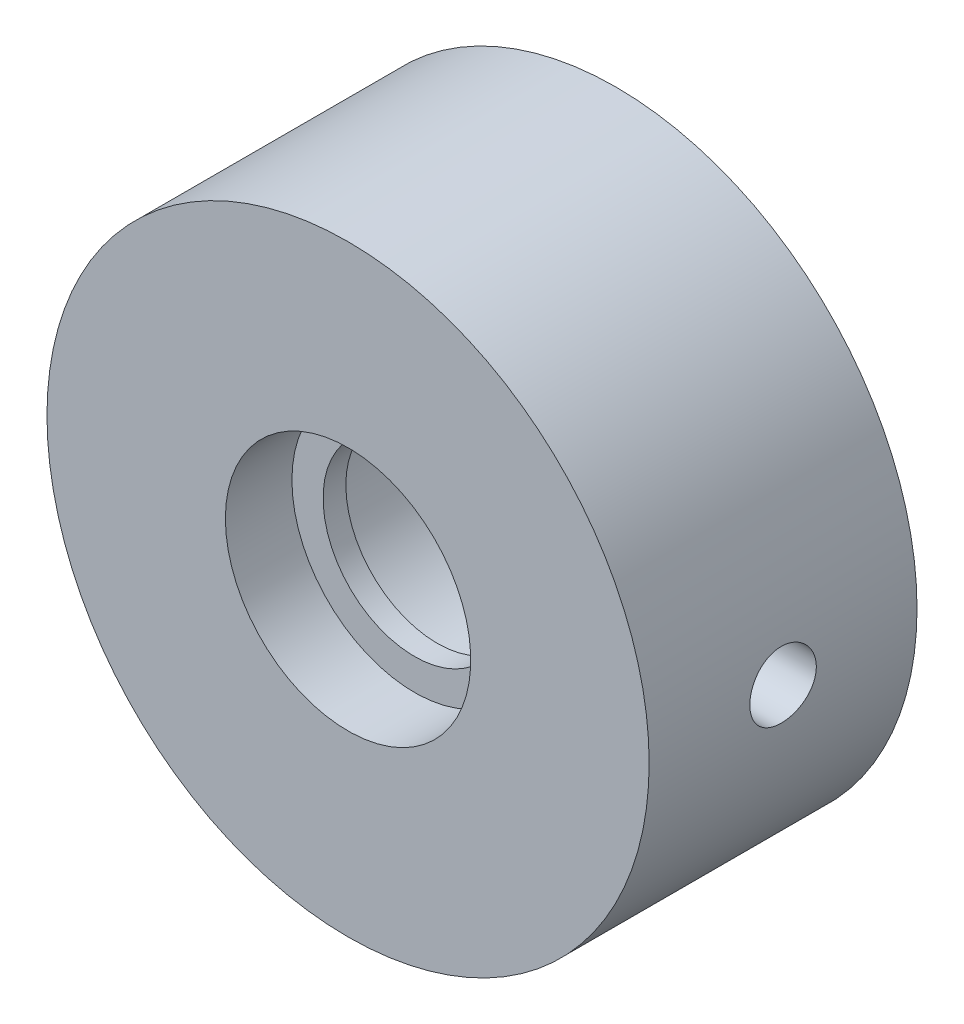
ISO-10303-21;
HEADER;
FILE_DESCRIPTION(('STEP AP214'),'2;1');
FILE_NAME('part.step','',(''),(''),'','','');
FILE_SCHEMA(('AUTOMOTIVE_DESIGN { 1 0 10303 214 1 1 1 1 }'));
ENDSEC;
DATA;
#1=APPLICATION_CONTEXT('core data for automotive mechanical design processes');
#2=APPLICATION_PROTOCOL_DEFINITION('international standard','automotive_design',2000,#1);
#3=PRODUCT_CONTEXT('',#1,'mechanical');
#4=PRODUCT('Part','Part','',(#3));
#5=PRODUCT_RELATED_PRODUCT_CATEGORY('part','',(#4));
#6=PRODUCT_DEFINITION_FORMATION('','',#4);
#7=PRODUCT_DEFINITION_CONTEXT('part definition',#1,'design');
#8=PRODUCT_DEFINITION('design','',#6,#7);
#9=PRODUCT_DEFINITION_SHAPE('','',#8);
#10=(LENGTH_UNIT() NAMED_UNIT(*) SI_UNIT(.MILLI.,.METRE.));
#11=(NAMED_UNIT(*) PLANE_ANGLE_UNIT() SI_UNIT($,.RADIAN.));
#12=(NAMED_UNIT(*) SI_UNIT($,.STERADIAN.) SOLID_ANGLE_UNIT());
#13=UNCERTAINTY_MEASURE_WITH_UNIT(LENGTH_MEASURE(1.E-05),#10,'distance_accuracy_value','');
#14=(GEOMETRIC_REPRESENTATION_CONTEXT(3) GLOBAL_UNCERTAINTY_ASSIGNED_CONTEXT((#13)) GLOBAL_UNIT_ASSIGNED_CONTEXT((#10,
#11,#12)) REPRESENTATION_CONTEXT('',''));
#15=CARTESIAN_POINT('',(0.,0.,0.));
#16=DIRECTION('',(0.,0.,1.));
#17=DIRECTION('',(1.,0.,0.));
#18=AXIS2_PLACEMENT_3D('',#15,#16,#17);
#19=CARTESIAN_POINT('',(0.,0.,12.7));
#20=DIRECTION('',(0.,0.,-1.));
#21=DIRECTION('',(-1.,0.,0.));
#22=AXIS2_PLACEMENT_3D('',#19,#20,#21);
#23=CYLINDRICAL_SURFACE('',#22,29.45);
#24=CARTESIAN_POINT('',(-29.45,0.,2.85));
#25=CARTESIAN_POINT('',(-29.4499977149586,-0.181960383413232,2.84999217446561));
#26=CARTESIAN_POINT('',(-29.4482957263121,-0.364038517707953,2.8346671753996));
#27=CARTESIAN_POINT('',(-29.4416698356493,-0.723139621909861,2.77376818784163));
#28=CARTESIAN_POINT('',(-29.4367424558724,-0.900156919729154,2.7281615475707));
#29=CARTESIAN_POINT('',(-29.4242215634285,-1.24388475956675,2.60804944180506));
#30=CARTESIAN_POINT('',(-29.4166297330742,-1.41060172719956,2.53356220818509));
#31=CARTESIAN_POINT('',(-29.3996270771881,-1.72913310495346,2.35784053475641));
#32=CARTESIAN_POINT('',(-29.3902165941078,-1.88095031259178,2.25661112917446));
#33=CARTESIAN_POINT('',(-29.3705837732319,-2.16606596648808,2.02980801548477));
#34=CARTESIAN_POINT('',(-29.3603584377793,-2.29929055881077,1.90414171562264));
#35=CARTESIAN_POINT('',(-29.340272914812,-2.54280390997775,1.63223017289141));
#36=CARTESIAN_POINT('',(-29.3304127448486,-2.6530915675656,1.48598394249615));
#37=CARTESIAN_POINT('',(-29.3121438744106,-2.84786774975347,1.17659411493971));
#38=CARTESIAN_POINT('',(-29.303739014861,-2.93228844317707,1.01340756842412));
#39=CARTESIAN_POINT('',(-29.2893706621716,-3.07250117978127,0.675066177501417));
#40=CARTESIAN_POINT('',(-29.283407096312,-3.12829407572217,0.49991168976958));
#41=CARTESIAN_POINT('',(-29.2746243646764,-3.20944616023457,0.143365575104309));
#42=CARTESIAN_POINT('',(-29.2717924446061,-3.23492882599818,-0.037997628138731));
#43=CARTESIAN_POINT('',(-29.2695543123403,-3.25511893582278,-0.402447022288139));
#44=CARTESIAN_POINT('',(-29.270147991671,-3.24982735436872,-0.585533158453516));
#45=CARTESIAN_POINT('',(-29.2746823184672,-3.20872078512459,-0.947376498382265));
#46=CARTESIAN_POINT('',(-29.2786081319526,-3.17304107664745,-1.12614928244152));
#47=CARTESIAN_POINT('',(-29.2893412373593,-3.07238178521974,-1.47515393371042));
#48=CARTESIAN_POINT('',(-29.2961485758003,-3.00740172924009,-1.64538566298274));
#49=CARTESIAN_POINT('',(-29.3118947025559,-2.84983848905485,-1.97290055105099));
#50=CARTESIAN_POINT('',(-29.3208380799992,-2.75719576485262,-2.13015483629939));
#51=CARTESIAN_POINT('',(-29.3398448589826,-2.54697968071543,-2.42693484093901));
#52=CARTESIAN_POINT('',(-29.3499083004653,-2.42940543156216,-2.56645992770922));
#53=CARTESIAN_POINT('',(-29.3700873721813,-2.17191049522814,-2.8246066892524));
#54=CARTESIAN_POINT('',(-29.3802029921148,-2.03187306443937,-2.94311194714852));
#55=CARTESIAN_POINT('',(-29.3992957570561,-1.73383096145639,-3.1549512073783));
#56=CARTESIAN_POINT('',(-29.4082729003268,-1.57582626184756,-3.24828517130465));
#57=CARTESIAN_POINT('',(-29.4240811421124,-1.24625059955246,-3.40712960387388));
#58=CARTESIAN_POINT('',(-29.4309117436384,-1.07467650663679,-3.47263363028452));
#59=CARTESIAN_POINT('',(-29.4416524644483,-0.722872816990234,-3.57387070648923));
#60=CARTESIAN_POINT('',(-29.4455626901665,-0.542643535955741,-3.60960484126366));
#61=CARTESIAN_POINT('',(-29.450008353616,-0.179653073637615,-3.65013884660106));
#62=CARTESIAN_POINT('',(-29.4505613050385,0.00308997507644454,-3.65509925557423));
#63=CARTESIAN_POINT('',(-29.4482772054799,0.366804755844156,-3.63436743191762));
#64=CARTESIAN_POINT('',(-29.4454402104758,0.5477765170967,-3.60867570543569));
#65=CARTESIAN_POINT('',(-29.4367060642113,0.902344231830607,-3.52750216585696));
#66=CARTESIAN_POINT('',(-29.4308166907755,1.07595772442449,-3.47209605613906));
#67=CARTESIAN_POINT('',(-29.4166379376567,1.41142720014704,-3.33314467485076));
#68=CARTESIAN_POINT('',(-29.4083484932122,1.57328286586479,-3.24959864396606));
#69=CARTESIAN_POINT('',(-29.3902519271435,1.88136462330686,-3.05634462394116));
#70=CARTESIAN_POINT('',(-29.3804387800833,2.02752458741648,-2.94653178900514));
#71=CARTESIAN_POINT('',(-29.3604138212173,2.29939529771544,-2.70401089277464));
#72=CARTESIAN_POINT('',(-29.3502019971814,2.42510541595537,-2.57130212867709));
#73=CARTESIAN_POINT('',(-29.3304773923802,2.65307013921571,-2.28605337193399));
#74=CARTESIAN_POINT('',(-29.3209678895867,2.75521896674557,-2.13342858514379));
#75=CARTESIAN_POINT('',(-29.3037761686943,2.93243293343001,-1.81309582481772));
#76=CARTESIAN_POINT('',(-29.2960939209767,3.00749851159833,-1.64538809582822));
#77=CARTESIAN_POINT('',(-29.283447806849,3.1282403081622,-1.30000447642978));
#78=CARTESIAN_POINT('',(-29.2784782409849,3.17397818087037,-1.12235035703359));
#79=CARTESIAN_POINT('',(-29.2718030390295,3.23496573333356,-0.76182578399482));
#80=CARTESIAN_POINT('',(-29.270097286978,3.25021649626864,-0.578955515911538));
#81=CARTESIAN_POINT('',(-29.2701456691,3.24978001675806,-0.214241333117374));
#82=CARTESIAN_POINT('',(-29.2718812211429,3.23425893418351,-0.0323971944360969));
#83=CARTESIAN_POINT('',(-29.2785769125366,3.17306908840828,0.326082528942359));
#84=CARTESIAN_POINT('',(-29.2835370543802,3.12740030190202,0.502718109612974));
#85=CARTESIAN_POINT('',(-29.2961176615934,3.00725970242105,0.84575731079249));
#86=CARTESIAN_POINT('',(-29.3037375620662,2.9327940051589,1.01216309515248));
#87=CARTESIAN_POINT('',(-29.3207801866999,2.75719006992938,1.33014198635245));
#88=CARTESIAN_POINT('',(-29.330202913552,2.65605179214502,1.48171507104961));
#89=CARTESIAN_POINT('',(-29.3498504947385,2.42935202374099,1.76657702871552));
#90=CARTESIAN_POINT('',(-29.360079255527,2.30366659303234,1.89976700209277));
#91=CARTESIAN_POINT('',(-29.3801510861024,2.03169260707532,2.14323419611267));
#92=CARTESIAN_POINT('',(-29.3899940635266,1.88539915600056,2.25350595664449));
#93=CARTESIAN_POINT('',(-29.4082169324075,1.57586994447326,2.4482770804155));
#94=CARTESIAN_POINT('',(-29.4165923396586,1.41258460660709,2.53269802355485));
#95=CARTESIAN_POINT('',(-29.43088925699,1.07416226480783,2.67280696091186));
#96=CARTESIAN_POINT('',(-29.4368134936662,0.899038683063386,2.72852689811667));
#97=CARTESIAN_POINT('',(-29.4440752845522,0.602463008697075,2.79597250400879));
#98=CARTESIAN_POINT('',(-29.4462865142643,0.482897465914857,2.81620458305384));
#99=CARTESIAN_POINT('',(-29.4492496287908,0.242238674853296,2.84322090048217));
#100=CARTESIAN_POINT('',(-29.450001521333,0.121145434667265,2.85000521007787));
#101=CARTESIAN_POINT('',(-29.45,0.,2.85));
#102=B_SPLINE_CURVE_WITH_KNOTS('',3,(#24,#25,#26,#27,#28,#29,#30,#31,#32,#33,#34,#35,#36,#37,
#38,#39,#40,#41,#42,#43,#44,#45,#46,#47,#48,#49,#50,#51,#52,#53,#54,#55,#56,#57,#58,#59,#60,#61,
#62,#63,#64,#65,#66,#67,#68,#69,#70,#71,#72,#73,#74,#75,#76,#77,#78,#79,#80,#81,#82,#83,#84,#85,
#86,#87,#88,#89,#90,#91,#92,#93,#94,#95,#96,#97,#98,#99,#100,#101),.UNSPECIFIED.,.T.,.F.,(4,2,2,
2,2,2,2,2,2,2,2,2,2,2,2,2,2,2,2,2,2,2,2,2,2,2,2,2,2,2,2,2,2,2,2,2,2,2,4),(0.,0.545438723906535,
1.09146653509159,1.63715020707216,2.18273122694985,2.73042122341586,3.27813750970529,
3.82727802212007,4.37640217587458,4.92328157249786,5.47014365195199,6.01458390561283,
6.55903294911109,7.10466239471214,7.65031130423784,8.19889380903299,8.7474771508714,
9.29618741280331,9.84487767580779,10.3907031427842,10.936519596863,11.4809520339322,
12.0253991628854,12.5720568622237,13.1187313445055,13.6678142989444,14.2168883524651,
14.7648042948169,15.3127007698537,15.8576468053305,16.4025932620761,16.9474240499126,
17.4922556510805,18.0399127811064,18.5877002375891,19.1371333454872,19.6859536294502,
20.049097298237,20.412239043998),.UNSPECIFIED.);
#103=CARTESIAN_POINT('',(-29.45,0.,2.85));
#104=VERTEX_POINT('',#103);
#105=EDGE_CURVE('E45',#104,#104,#102,.T.);
#106=ORIENTED_EDGE('',*,*,#105,.T.);
#107=EDGE_LOOP('',(#106));
#108=FACE_BOUND('',#107,.T.);
#109=CARTESIAN_POINT('',(0.,0.,12.7));
#110=DIRECTION('',(0.,0.,1.));
#111=DIRECTION('',(1.,0.,0.));
#112=AXIS2_PLACEMENT_3D('',#109,#110,#111);
#113=CIRCLE('',#112,29.45);
#114=CARTESIAN_POINT('',(29.45,0.,12.7));
#115=VERTEX_POINT('',#114);
#116=EDGE_CURVE('E53',#115,#115,#113,.T.);
#117=ORIENTED_EDGE('',*,*,#116,.F.);
#118=EDGE_LOOP('',(#117));
#119=FACE_BOUND('',#118,.T.);
#120=CARTESIAN_POINT('',(0.,0.,-13.5));
#121=DIRECTION('',(0.,0.,-1.));
#122=DIRECTION('',(-1.,0.,0.));
#123=AXIS2_PLACEMENT_3D('',#120,#121,#122);
#124=CIRCLE('',#123,29.45);
#125=CARTESIAN_POINT('',(-29.45,0.,-13.5));
#126=VERTEX_POINT('',#125);
#127=EDGE_CURVE('E106',#126,#126,#124,.T.);
#128=ORIENTED_EDGE('',*,*,#127,.F.);
#129=EDGE_LOOP('',(#128));
#130=FACE_BOUND('',#129,.T.);
#131=CARTESIAN_POINT('',(29.45,0.,-3.65));
#132=CARTESIAN_POINT('',(29.4499977149586,0.181960383413232,-3.6499921744656));
#133=CARTESIAN_POINT('',(29.4482957263121,0.364038517707953,-3.63466717539959));
#134=CARTESIAN_POINT('',(29.4416698356493,0.723139621909861,-3.57376818784162));
#135=CARTESIAN_POINT('',(29.4367424558724,0.900156919729154,-3.5281615475707));
#136=CARTESIAN_POINT('',(29.4242215634285,1.24388475956675,-3.40804944180505));
#137=CARTESIAN_POINT('',(29.4166297330742,1.41060172719956,-3.33356220818508));
#138=CARTESIAN_POINT('',(29.3996270771881,1.72913310495346,-3.1578405347564));
#139=CARTESIAN_POINT('',(29.3902165941078,1.88095031259178,-3.05661112917446));
#140=CARTESIAN_POINT('',(29.3705837732319,2.16606596648808,-2.82980801548477));
#141=CARTESIAN_POINT('',(29.3603584377793,2.29929055881077,-2.70414171562264));
#142=CARTESIAN_POINT('',(29.340272914812,2.54280390997775,-2.4322301728914));
#143=CARTESIAN_POINT('',(29.3304127448486,2.6530915675656,-2.28598394249615));
#144=CARTESIAN_POINT('',(29.3121438744106,2.84786774975347,-1.9765941149397));
#145=CARTESIAN_POINT('',(29.303739014861,2.93228844317707,-1.81340756842411));
#146=CARTESIAN_POINT('',(29.2893706621716,3.07250117978127,-1.47506617750141));
#147=CARTESIAN_POINT('',(29.283407096312,3.12829407572217,-1.29991168976958));
#148=CARTESIAN_POINT('',(29.2746243646764,3.20944616023457,-0.943365575104304));
#149=CARTESIAN_POINT('',(29.2717924446061,3.23492882599818,-0.762002371861264));
#150=CARTESIAN_POINT('',(29.2695543123403,3.25511893582278,-0.397552977711856));
#151=CARTESIAN_POINT('',(29.270147991671,3.24982735436872,-0.214466841546479));
#152=CARTESIAN_POINT('',(29.2746823184672,3.20872078512459,0.14737649838227));
#153=CARTESIAN_POINT('',(29.2786081319526,3.17304107664745,0.326149282441523));
#154=CARTESIAN_POINT('',(29.2893412373593,3.07238178521974,0.675153933710431));
#155=CARTESIAN_POINT('',(29.2961485758003,3.00740172924009,0.845385662982745));
#156=CARTESIAN_POINT('',(29.3118947025559,2.84983848905485,1.172900551051));
#157=CARTESIAN_POINT('',(29.3208380799992,2.75719576485262,1.3301548362994));
#158=CARTESIAN_POINT('',(29.3398448589826,2.54697968071543,1.62693484093902));
#159=CARTESIAN_POINT('',(29.3499083004653,2.42940543156216,1.76645992770922));
#160=CARTESIAN_POINT('',(29.3700873721813,2.17191049522814,2.02460668925241));
#161=CARTESIAN_POINT('',(29.3802029921148,2.03187306443937,2.14311194714853));
#162=CARTESIAN_POINT('',(29.3992957570561,1.73383096145639,2.35495120737831));
#163=CARTESIAN_POINT('',(29.4082729003268,1.57582626184756,2.44828517130465));
#164=CARTESIAN_POINT('',(29.4240811421124,1.24625059955246,2.60712960387388));
#165=CARTESIAN_POINT('',(29.4309117436384,1.07467650663679,2.67263363028452));
#166=CARTESIAN_POINT('',(29.4416524644483,0.722872816990234,2.77387070648923));
#167=CARTESIAN_POINT('',(29.4455626901665,0.54264353595574,2.80960484126366));
#168=CARTESIAN_POINT('',(29.450008353616,0.179653073637614,2.85013884660107));
#169=CARTESIAN_POINT('',(29.4505613050385,-0.00308997507644535,2.85509925557424));
#170=CARTESIAN_POINT('',(29.4482772054799,-0.366804755844157,2.83436743191763));
#171=CARTESIAN_POINT('',(29.4454402104758,-0.547776517096701,2.80867570543569));
#172=CARTESIAN_POINT('',(29.4367060642113,-0.902344231830608,2.72750216585696));
#173=CARTESIAN_POINT('',(29.4308166907755,-1.07595772442449,2.67209605613907));
#174=CARTESIAN_POINT('',(29.4166379376567,-1.41142720014704,2.53314467485077));
#175=CARTESIAN_POINT('',(29.4083484932122,-1.57328286586479,2.44959864396606));
#176=CARTESIAN_POINT('',(29.3902519271435,-1.88136462330686,2.25634462394116));
#177=CARTESIAN_POINT('',(29.3804387800833,-2.02752458741648,2.14653178900514));
#178=CARTESIAN_POINT('',(29.3604138212173,-2.29939529771544,1.90401089277464));
#179=CARTESIAN_POINT('',(29.3502019971814,-2.42510541595537,1.7713021286771));
#180=CARTESIAN_POINT('',(29.3304773923802,-2.65307013921571,1.48605337193399));
#181=CARTESIAN_POINT('',(29.3209678895867,-2.75521896674557,1.33342858514379));
#182=CARTESIAN_POINT('',(29.3037761686943,-2.93243293343001,1.01309582481773));
#183=CARTESIAN_POINT('',(29.2960939209767,-3.00749851159833,0.845388095828223));
#184=CARTESIAN_POINT('',(29.283447806849,-3.1282403081622,0.500004476429781));
#185=CARTESIAN_POINT('',(29.2784782409849,-3.17397818087037,0.322350357033594));
#186=CARTESIAN_POINT('',(29.2718030390295,-3.23496573333356,-0.0381742160051773));
#187=CARTESIAN_POINT('',(29.270097286978,-3.25021649626864,-0.221044484088459));
#188=CARTESIAN_POINT('',(29.2701456691,-3.24978001675806,-0.585758666882624));
#189=CARTESIAN_POINT('',(29.2718812211429,-3.23425893418351,-0.767602805563901));
#190=CARTESIAN_POINT('',(29.2785769125366,-3.17306908840828,-1.12608252894236));
#191=CARTESIAN_POINT('',(29.2835370543802,-3.12740030190202,-1.30271810961297));
#192=CARTESIAN_POINT('',(29.2961176615934,-3.00725970242105,-1.64575731079249));
#193=CARTESIAN_POINT('',(29.3037375620662,-2.9327940051589,-1.81216309515248));
#194=CARTESIAN_POINT('',(29.3207801866999,-2.75719006992938,-2.13014198635245));
#195=CARTESIAN_POINT('',(29.330202913552,-2.65605179214501,-2.28171507104961));
#196=CARTESIAN_POINT('',(29.3498504947385,-2.42935202374098,-2.56657702871551));
#197=CARTESIAN_POINT('',(29.360079255527,-2.30366659303234,-2.69976700209277));
#198=CARTESIAN_POINT('',(29.3801510861024,-2.03169260707532,-2.94323419611266));
#199=CARTESIAN_POINT('',(29.3899940635266,-1.88539915600056,-3.05350595664449));
#200=CARTESIAN_POINT('',(29.4082169324075,-1.57586994447326,-3.24827708041549));
#201=CARTESIAN_POINT('',(29.4165923396586,-1.41258460660708,-3.33269802355484));
#202=CARTESIAN_POINT('',(29.43088925699,-1.07416226480783,-3.47280696091185));
#203=CARTESIAN_POINT('',(29.4368134936662,-0.899038683063384,-3.52852689811667));
#204=CARTESIAN_POINT('',(29.4440752845522,-0.602463008697073,-3.59597250400879));
#205=CARTESIAN_POINT('',(29.4462865142643,-0.482897465914856,-3.61620458305384));
#206=CARTESIAN_POINT('',(29.4492496287908,-0.242238674853296,-3.64322090048216));
#207=CARTESIAN_POINT('',(29.450001521333,-0.121145434667265,-3.65000521007786));
#208=CARTESIAN_POINT('',(29.45,0.,-3.65));
#209=B_SPLINE_CURVE_WITH_KNOTS('',3,(#131,#132,#133,#134,#135,#136,#137,#138,#139,#140,#141,
#142,#143,#144,#145,#146,#147,#148,#149,#150,#151,#152,#153,#154,#155,#156,#157,#158,#159,#160,
#161,#162,#163,#164,#165,#166,#167,#168,#169,#170,#171,#172,#173,#174,#175,#176,#177,#178,#179,
#180,#181,#182,#183,#184,#185,#186,#187,#188,#189,#190,#191,#192,#193,#194,#195,#196,#197,#198,
#199,#200,#201,#202,#203,#204,#205,#206,#207,#208),.UNSPECIFIED.,.T.,.F.,(4,2,2,2,2,2,2,2,2,2,2,
2,2,2,2,2,2,2,2,2,2,2,2,2,2,2,2,2,2,2,2,2,2,2,2,2,2,2,4),(0.,0.545438723906535,1.09146653509159,
1.63715020707216,2.18273122694985,2.73042122341586,3.27813750970529,3.82727802212007,
4.37640217587458,4.92328157249786,5.47014365195199,6.01458390561283,6.55903294911109,
7.10466239471214,7.65031130423784,8.19889380903299,8.7474771508714,9.29618741280331,
9.84487767580779,10.3907031427842,10.936519596863,11.4809520339322,12.0253991628854,
12.5720568622237,13.1187313445055,13.6678142989444,14.2168883524651,14.7648042948169,
15.3127007698538,15.8576468053305,16.4025932620761,16.9474240499126,17.4922556510805,
18.0399127811064,18.5877002375891,19.1371333454872,19.6859536294502,20.049097298237,
20.412239043998),.UNSPECIFIED.);
#210=CARTESIAN_POINT('',(29.45,0.,-3.65));
#211=VERTEX_POINT('',#210);
#212=EDGE_CURVE('E10',#211,#211,#209,.T.);
#213=ORIENTED_EDGE('',*,*,#212,.F.);
#214=EDGE_LOOP('',(#213));
#215=FACE_BOUND('',#214,.T.);
#216=ADVANCED_FACE('F35',(#108,#119,#130,#215),#23,.T.);
#217=CARTESIAN_POINT('',(0.,0.,12.7));
#218=DIRECTION('',(0.,0.,-1.));
#219=DIRECTION('',(-1.,0.,0.));
#220=AXIS2_PLACEMENT_3D('',#217,#218,#219);
#221=CYLINDRICAL_SURFACE('',#220,12.);
#222=CARTESIAN_POINT('',(0.,0.,12.7));
#223=DIRECTION('',(0.,0.,-1.));
#224=DIRECTION('',(-1.,0.,0.));
#225=AXIS2_PLACEMENT_3D('',#222,#223,#224);
#226=CIRCLE('',#225,12.);
#227=CARTESIAN_POINT('',(-12.,0.,12.7));
#228=VERTEX_POINT('',#227);
#229=EDGE_CURVE('E120',#228,#228,#226,.T.);
#230=ORIENTED_EDGE('',*,*,#229,.F.);
#231=EDGE_LOOP('',(#230));
#232=FACE_BOUND('',#231,.T.);
#233=CARTESIAN_POINT('',(0.,0.,6.19125));
#234=DIRECTION('',(0.,0.,-1.));
#235=DIRECTION('',(-1.,0.,0.));
#236=AXIS2_PLACEMENT_3D('',#233,#234,#235);
#237=CIRCLE('',#236,12.);
#238=CARTESIAN_POINT('',(-12.,0.,6.19125));
#239=VERTEX_POINT('',#238);
#240=EDGE_CURVE('E49',#239,#239,#237,.F.);
#241=ORIENTED_EDGE('',*,*,#240,.F.);
#242=EDGE_LOOP('',(#241));
#243=FACE_BOUND('',#242,.T.);
#244=ADVANCED_FACE('F87',(#232,#243),#221,.F.);
#245=CARTESIAN_POINT('',(0.,0.,12.7));
#246=DIRECTION('',(0.,0.,1.));
#247=DIRECTION('',(1.,0.,0.));
#248=AXIS2_PLACEMENT_3D('',#245,#246,#247);
#249=PLANE('',#248);
#250=ORIENTED_EDGE('',*,*,#229,.T.);
#251=EDGE_LOOP('',(#250));
#252=FACE_BOUND('',#251,.T.);
#253=ORIENTED_EDGE('',*,*,#116,.T.);
#254=EDGE_LOOP('',(#253));
#255=FACE_BOUND('',#254,.T.);
#256=ADVANCED_FACE('F85',(#252,#255),#249,.T.);
#257=CARTESIAN_POINT('',(0.,0.,3.96875));
#258=DIRECTION('',(0.,0.,-1.));
#259=DIRECTION('',(-1.,0.,0.));
#260=AXIS2_PLACEMENT_3D('',#257,#258,#259);
#261=CIRCLE('',#260,12.);
#262=CARTESIAN_POINT('',(-12.,0.,3.96875));
#263=VERTEX_POINT('',#262);
#264=EDGE_CURVE('E117',#263,#263,#261,.T.);
#265=ORIENTED_EDGE('',*,*,#264,.F.);
#266=EDGE_LOOP('',(#265));
#267=FACE_BOUND('',#266,.T.);
#268=CARTESIAN_POINT('',(0.,0.,-13.5));
#269=DIRECTION('',(0.,0.,-1.));
#270=DIRECTION('',(-1.,0.,0.));
#271=AXIS2_PLACEMENT_3D('',#268,#269,#270);
#272=CIRCLE('',#271,12.);
#273=CARTESIAN_POINT('',(-12.,0.,-13.5));
#274=VERTEX_POINT('',#273);
#275=EDGE_CURVE('E108',#274,#274,#272,.T.);
#276=ORIENTED_EDGE('',*,*,#275,.T.);
#277=EDGE_LOOP('',(#276));
#278=FACE_BOUND('',#277,.T.);
#279=ADVANCED_FACE('F82',(#267,#278),#221,.F.);
#280=CARTESIAN_POINT('',(0.,0.,3.96875));
#281=DIRECTION('',(0.,0.,-1.));
#282=DIRECTION('',(-1.,0.,0.));
#283=AXIS2_PLACEMENT_3D('',#280,#281,#282);
#284=PLANE('',#283);
#285=CARTESIAN_POINT('',(0.,0.,3.96875));
#286=DIRECTION('',(0.,0.,-1.));
#287=DIRECTION('',(-1.,0.,0.));
#288=AXIS2_PLACEMENT_3D('',#285,#286,#287);
#289=CIRCLE('',#288,8.95);
#290=CARTESIAN_POINT('',(-8.95,0.,3.96875));
#291=VERTEX_POINT('',#290);
#292=EDGE_CURVE('E59',#291,#291,#289,.T.);
#293=ORIENTED_EDGE('',*,*,#292,.F.);
#294=EDGE_LOOP('',(#293));
#295=FACE_BOUND('',#294,.T.);
#296=ORIENTED_EDGE('',*,*,#264,.T.);
#297=EDGE_LOOP('',(#296));
#298=FACE_BOUND('',#297,.T.);
#299=ADVANCED_FACE('F78',(#295,#298),#284,.T.);
#300=CARTESIAN_POINT('',(0.,0.,6.19125));
#301=DIRECTION('',(0.,0.,-1.));
#302=DIRECTION('',(-1.,0.,0.));
#303=AXIS2_PLACEMENT_3D('',#300,#301,#302);
#304=PLANE('',#303);
#305=CARTESIAN_POINT('',(0.,0.,6.19125));
#306=DIRECTION('',(0.,0.,1.));
#307=DIRECTION('',(1.,0.,0.));
#308=AXIS2_PLACEMENT_3D('',#305,#306,#307);
#309=CIRCLE('',#308,8.95);
#310=CARTESIAN_POINT('',(8.95,0.,6.19125));
#311=VERTEX_POINT('',#310);
#312=EDGE_CURVE('E107',#311,#311,#309,.T.);
#313=ORIENTED_EDGE('',*,*,#312,.F.);
#314=EDGE_LOOP('',(#313));
#315=FACE_BOUND('',#314,.T.);
#316=ORIENTED_EDGE('',*,*,#240,.T.);
#317=EDGE_LOOP('',(#316));
#318=FACE_BOUND('',#317,.T.);
#319=ADVANCED_FACE('F74',(#315,#318),#304,.F.);
#320=CARTESIAN_POINT('',(0.,0.,0.));
#321=DIRECTION('',(0.,0.,1.));
#322=DIRECTION('',(1.,0.,0.));
#323=AXIS2_PLACEMENT_3D('',#320,#321,#322);
#324=CYLINDRICAL_SURFACE('',#323,8.95);
#325=ORIENTED_EDGE('',*,*,#292,.T.);
#326=EDGE_LOOP('',(#325));
#327=FACE_BOUND('',#326,.T.);
#328=ORIENTED_EDGE('',*,*,#312,.T.);
#329=EDGE_LOOP('',(#328));
#330=FACE_BOUND('',#329,.T.);
#331=ADVANCED_FACE('F70',(#327,#330),#324,.F.);
#332=CARTESIAN_POINT('',(0.,0.,-13.5));
#333=DIRECTION('',(0.,0.,-1.));
#334=DIRECTION('',(-1.,0.,0.));
#335=AXIS2_PLACEMENT_3D('',#332,#333,#334);
#336=PLANE('',#335);
#337=ORIENTED_EDGE('',*,*,#127,.T.);
#338=EDGE_LOOP('',(#337));
#339=FACE_BOUND('',#338,.T.);
#340=ORIENTED_EDGE('',*,*,#275,.F.);
#341=EDGE_LOOP('',(#340));
#342=FACE_BOUND('',#341,.T.);
#343=ADVANCED_FACE('F66',(#339,#342),#336,.T.);
#344=CARTESIAN_POINT('',(-20.45,0.,-0.399999999999998));
#345=DIRECTION('',(-1.,0.,0.));
#346=DIRECTION('',(0.,0.,1.));
#347=AXIS2_PLACEMENT_3D('',#344,#345,#346);
#348=CYLINDRICAL_SURFACE('',#347,3.25);
#349=CARTESIAN_POINT('',(-20.45,0.,-0.399999999999998));
#350=DIRECTION('',(-1.,0.,0.));
#351=DIRECTION('',(0.,0.,1.));
#352=AXIS2_PLACEMENT_3D('',#349,#350,#351);
#353=CIRCLE('',#352,3.25);
#354=CARTESIAN_POINT('',(-20.45,0.,2.85));
#355=VERTEX_POINT('',#354);
#356=EDGE_CURVE('E113',#355,#355,#353,.T.);
#357=ORIENTED_EDGE('',*,*,#356,.F.);
#358=EDGE_LOOP('',(#357));
#359=FACE_BOUND('',#358,.T.);
#360=ORIENTED_EDGE('',*,*,#105,.F.);
#361=EDGE_LOOP('',(#360));
#362=FACE_BOUND('',#361,.T.);
#363=ADVANCED_FACE('F60',(#359,#362),#348,.F.);
#364=CARTESIAN_POINT('',(-20.45,0.,-0.399999999999998));
#365=DIRECTION('',(-1.,0.,0.));
#366=DIRECTION('',(0.,0.,1.));
#367=AXIS2_PLACEMENT_3D('',#364,#365,#366);
#368=PLANE('',#367);
#369=ORIENTED_EDGE('',*,*,#356,.T.);
#370=EDGE_LOOP('',(#369));
#371=FACE_BOUND('',#370,.T.);
#372=ADVANCED_FACE('F65',(#371),#368,.T.);
#373=CARTESIAN_POINT('',(20.45,0.,-0.399999999999998));
#374=DIRECTION('',(1.,0.,0.));
#375=DIRECTION('',(0.,0.,-1.));
#376=AXIS2_PLACEMENT_3D('',#373,#374,#375);
#377=CYLINDRICAL_SURFACE('',#376,3.25);
#378=CARTESIAN_POINT('',(20.45,0.,-0.399999999999998));
#379=DIRECTION('',(-1.,0.,0.));
#380=DIRECTION('',(0.,0.,1.));
#381=AXIS2_PLACEMENT_3D('',#378,#379,#380);
#382=CIRCLE('',#381,3.25);
#383=CARTESIAN_POINT('',(20.45,0.,2.85));
#384=VERTEX_POINT('',#383);
#385=EDGE_CURVE('E137',#384,#384,#382,.T.);
#386=ORIENTED_EDGE('',*,*,#385,.T.);
#387=EDGE_LOOP('',(#386));
#388=FACE_BOUND('',#387,.T.);
#389=ORIENTED_EDGE('',*,*,#212,.T.);
#390=EDGE_LOOP('',(#389));
#391=FACE_BOUND('',#390,.T.);
#392=ADVANCED_FACE('F141',(#388,#391),#377,.F.);
#393=CARTESIAN_POINT('',(20.45,0.,-0.399999999999998));
#394=DIRECTION('',(1.,0.,0.));
#395=DIRECTION('',(0.,0.,1.));
#396=AXIS2_PLACEMENT_3D('',#393,#394,#395);
#397=PLANE('',#396);
#398=ORIENTED_EDGE('',*,*,#385,.F.);
#399=EDGE_LOOP('',(#398));
#400=FACE_BOUND('',#399,.T.);
#401=ADVANCED_FACE('F143',(#400),#397,.T.);
#402=CLOSED_SHELL('',(#216,#244,#256,#279,#299,#319,#331,#343,#363,#372,#392,#401));
#403=MANIFOLD_SOLID_BREP('B2',#402);
#404=ADVANCED_BREP_SHAPE_REPRESENTATION('',(#18,#403),#14);
#405=SHAPE_DEFINITION_REPRESENTATION(#9,#404);
ENDSEC;
END-ISO-10303-21;
